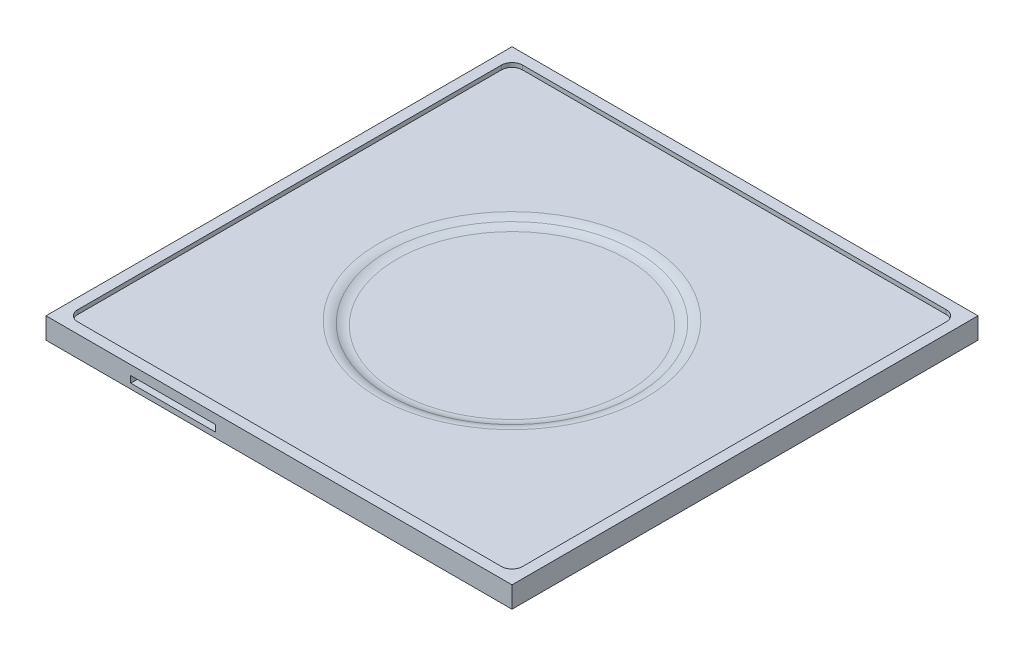
ISO-10303-21;
HEADER;
FILE_DESCRIPTION(('STEP AP214'),'2;1');
FILE_NAME('part.step','',(''),(''),'','','');
FILE_SCHEMA(('AUTOMOTIVE_DESIGN { 1 0 10303 214 1 1 1 1 }'));
ENDSEC;
DATA;
#1=APPLICATION_CONTEXT('core data for automotive mechanical design processes');
#2=APPLICATION_PROTOCOL_DEFINITION('international standard','automotive_design',2000,#1);
#3=PRODUCT_CONTEXT('',#1,'mechanical');
#4=PRODUCT('Part','Part','',(#3));
#5=PRODUCT_RELATED_PRODUCT_CATEGORY('part','',(#4));
#6=PRODUCT_DEFINITION_FORMATION('','',#4);
#7=PRODUCT_DEFINITION_CONTEXT('part definition',#1,'design');
#8=PRODUCT_DEFINITION('design','',#6,#7);
#9=PRODUCT_DEFINITION_SHAPE('','',#8);
#10=(LENGTH_UNIT() NAMED_UNIT(*) SI_UNIT(.MILLI.,.METRE.));
#11=(NAMED_UNIT(*) PLANE_ANGLE_UNIT() SI_UNIT($,.RADIAN.));
#12=(NAMED_UNIT(*) SI_UNIT($,.STERADIAN.) SOLID_ANGLE_UNIT());
#13=UNCERTAINTY_MEASURE_WITH_UNIT(LENGTH_MEASURE(1.E-05),#10,'distance_accuracy_value','');
#14=(GEOMETRIC_REPRESENTATION_CONTEXT(3) GLOBAL_UNCERTAINTY_ASSIGNED_CONTEXT((#13)) GLOBAL_UNIT_ASSIGNED_CONTEXT((#10,
#11,#12)) REPRESENTATION_CONTEXT('',''));
#15=CARTESIAN_POINT('',(0.,0.,0.));
#16=DIRECTION('',(0.,0.,1.));
#17=DIRECTION('',(1.,0.,0.));
#18=AXIS2_PLACEMENT_3D('',#15,#16,#17);
#19=CARTESIAN_POINT('',(-110.,10.,-110.));
#20=DIRECTION('',(1.,0.,0.));
#21=DIRECTION('',(0.,0.,-1.));
#22=AXIS2_PLACEMENT_3D('',#19,#20,#21);
#23=PLANE('',#22);
#24=DIRECTION('',(0.,0.,1.));
#25=VECTOR('',#24,1.);
#26=CARTESIAN_POINT('',(-110.,0.,-110.));
#27=LINE('',#26,#25);
#28=CARTESIAN_POINT('',(-110.,0.,-110.));
#29=VERTEX_POINT('',#28);
#30=CARTESIAN_POINT('',(-110.,0.,110.));
#31=VERTEX_POINT('',#30);
#32=EDGE_CURVE('E223',#29,#31,#27,.T.);
#33=ORIENTED_EDGE('',*,*,#32,.T.);
#34=DIRECTION('',(0.,-1.,0.));
#35=VECTOR('',#34,1.);
#36=CARTESIAN_POINT('',(-110.,10.,110.));
#37=LINE('',#36,#35);
#38=CARTESIAN_POINT('',(-110.,10.,110.));
#39=VERTEX_POINT('',#38);
#40=EDGE_CURVE('E272',#39,#31,#37,.T.);
#41=ORIENTED_EDGE('',*,*,#40,.F.);
#42=DIRECTION('',(0.,0.,1.));
#43=VECTOR('',#42,1.);
#44=CARTESIAN_POINT('',(-110.,10.,-110.));
#45=LINE('',#44,#43);
#46=CARTESIAN_POINT('',(-110.,10.,-110.));
#47=VERTEX_POINT('',#46);
#48=EDGE_CURVE('E235',#47,#39,#45,.T.);
#49=ORIENTED_EDGE('',*,*,#48,.F.);
#50=DIRECTION('',(0.,-1.,0.));
#51=VECTOR('',#50,1.);
#52=CARTESIAN_POINT('',(-110.,10.,-110.));
#53=LINE('',#52,#51);
#54=EDGE_CURVE('E249',#47,#29,#53,.T.);
#55=ORIENTED_EDGE('',*,*,#54,.T.);
#56=EDGE_LOOP('',(#33,#41,#49,#55));
#57=FACE_BOUND('',#56,.T.);
#58=ADVANCED_FACE('F44',(#57),#23,.F.);
#59=CARTESIAN_POINT('',(110.,10.,110.));
#60=DIRECTION('',(0.,0.,-1.));
#61=DIRECTION('',(-1.,0.,0.));
#62=AXIS2_PLACEMENT_3D('',#59,#60,#61);
#63=PLANE('',#62);
#64=DIRECTION('',(1.,0.,0.));
#65=VECTOR('',#64,1.);
#66=CARTESIAN_POINT('',(-70.,2.45,110.));
#67=LINE('',#66,#65);
#68=CARTESIAN_POINT('',(-70.,2.45,110.));
#69=VERTEX_POINT('',#68);
#70=CARTESIAN_POINT('',(-30.,2.45,110.));
#71=VERTEX_POINT('',#70);
#72=EDGE_CURVE('E193',#69,#71,#67,.T.);
#73=ORIENTED_EDGE('',*,*,#72,.F.);
#74=DIRECTION('',(0.,-1.,0.));
#75=VECTOR('',#74,1.);
#76=CARTESIAN_POINT('',(-70.,5.55,110.));
#77=LINE('',#76,#75);
#78=CARTESIAN_POINT('',(-70.,5.55,110.));
#79=VERTEX_POINT('',#78);
#80=EDGE_CURVE('E60',#79,#69,#77,.T.);
#81=ORIENTED_EDGE('',*,*,#80,.F.);
#82=DIRECTION('',(-1.,0.,0.));
#83=VECTOR('',#82,1.);
#84=CARTESIAN_POINT('',(-70.,5.55,110.));
#85=LINE('',#84,#83);
#86=CARTESIAN_POINT('',(-30.,5.55,110.));
#87=VERTEX_POINT('',#86);
#88=EDGE_CURVE('E180',#87,#79,#85,.T.);
#89=ORIENTED_EDGE('',*,*,#88,.F.);
#90=DIRECTION('',(0.,1.,0.));
#91=VECTOR('',#90,1.);
#92=CARTESIAN_POINT('',(-30.,5.55,110.));
#93=LINE('',#92,#91);
#94=EDGE_CURVE('E184',#71,#87,#93,.T.);
#95=ORIENTED_EDGE('',*,*,#94,.F.);
#96=EDGE_LOOP('',(#73,#81,#89,#95));
#97=FACE_BOUND('',#96,.T.);
#98=DIRECTION('',(1.,0.,0.));
#99=VECTOR('',#98,1.);
#100=CARTESIAN_POINT('',(110.,0.,110.));
#101=LINE('',#100,#99);
#102=CARTESIAN_POINT('',(110.,0.,110.));
#103=VERTEX_POINT('',#102);
#104=EDGE_CURVE('E253',#31,#103,#101,.T.);
#105=ORIENTED_EDGE('',*,*,#104,.T.);
#106=DIRECTION('',(0.,-1.,0.));
#107=VECTOR('',#106,1.);
#108=CARTESIAN_POINT('',(110.,10.,110.));
#109=LINE('',#108,#107);
#110=CARTESIAN_POINT('',(110.,10.,110.));
#111=VERTEX_POINT('',#110);
#112=EDGE_CURVE('E268',#111,#103,#109,.T.);
#113=ORIENTED_EDGE('',*,*,#112,.F.);
#114=DIRECTION('',(1.,0.,0.));
#115=VECTOR('',#114,1.);
#116=CARTESIAN_POINT('',(110.,10.,110.));
#117=LINE('',#116,#115);
#118=EDGE_CURVE('E239',#39,#111,#117,.T.);
#119=ORIENTED_EDGE('',*,*,#118,.F.);
#120=ORIENTED_EDGE('',*,*,#40,.T.);
#121=EDGE_LOOP('',(#105,#113,#119,#120));
#122=FACE_BOUND('',#121,.T.);
#123=ADVANCED_FACE('F384',(#97,#122),#63,.F.);
#124=CARTESIAN_POINT('',(110.,10.,-110.));
#125=DIRECTION('',(-1.,0.,0.));
#126=DIRECTION('',(0.,0.,1.));
#127=AXIS2_PLACEMENT_3D('',#124,#125,#126);
#128=PLANE('',#127);
#129=DIRECTION('',(0.,0.,-1.));
#130=VECTOR('',#129,1.);
#131=CARTESIAN_POINT('',(110.,0.,-110.));
#132=LINE('',#131,#130);
#133=CARTESIAN_POINT('',(110.,0.,-110.));
#134=VERTEX_POINT('',#133);
#135=EDGE_CURVE('E256',#103,#134,#132,.T.);
#136=ORIENTED_EDGE('',*,*,#135,.T.);
#137=DIRECTION('',(0.,-1.,0.));
#138=VECTOR('',#137,1.);
#139=CARTESIAN_POINT('',(110.,10.,-110.));
#140=LINE('',#139,#138);
#141=CARTESIAN_POINT('',(110.,10.,-110.));
#142=VERTEX_POINT('',#141);
#143=EDGE_CURVE('E264',#142,#134,#140,.T.);
#144=ORIENTED_EDGE('',*,*,#143,.F.);
#145=DIRECTION('',(0.,0.,-1.));
#146=VECTOR('',#145,1.);
#147=CARTESIAN_POINT('',(110.,10.,-110.));
#148=LINE('',#147,#146);
#149=EDGE_CURVE('E243',#111,#142,#148,.T.);
#150=ORIENTED_EDGE('',*,*,#149,.F.);
#151=ORIENTED_EDGE('',*,*,#112,.T.);
#152=EDGE_LOOP('',(#136,#144,#150,#151));
#153=FACE_BOUND('',#152,.T.);
#154=ADVANCED_FACE('F390',(#153),#128,.F.);
#155=CARTESIAN_POINT('',(110.,10.,-110.));
#156=DIRECTION('',(0.,0.,1.));
#157=DIRECTION('',(1.,0.,0.));
#158=AXIS2_PLACEMENT_3D('',#155,#156,#157);
#159=PLANE('',#158);
#160=DIRECTION('',(-1.,0.,0.));
#161=VECTOR('',#160,1.);
#162=CARTESIAN_POINT('',(110.,0.,-110.));
#163=LINE('',#162,#161);
#164=EDGE_CURVE('E240',#134,#29,#163,.T.);
#165=ORIENTED_EDGE('',*,*,#164,.T.);
#166=ORIENTED_EDGE('',*,*,#54,.F.);
#167=DIRECTION('',(-1.,0.,0.));
#168=VECTOR('',#167,1.);
#169=CARTESIAN_POINT('',(110.,10.,-110.));
#170=LINE('',#169,#168);
#171=EDGE_CURVE('E246',#142,#47,#170,.T.);
#172=ORIENTED_EDGE('',*,*,#171,.F.);
#173=ORIENTED_EDGE('',*,*,#143,.T.);
#174=EDGE_LOOP('',(#165,#166,#172,#173));
#175=FACE_BOUND('',#174,.T.);
#176=ADVANCED_FACE('F431',(#175),#159,.F.);
#177=CARTESIAN_POINT('',(0.,10.,0.));
#178=DIRECTION('',(0.,-1.,0.));
#179=DIRECTION('',(0.,0.,-1.));
#180=AXIS2_PLACEMENT_3D('',#177,#178,#179);
#181=PLANE('',#180);
#182=DIRECTION('',(1.,0.,0.));
#183=VECTOR('',#182,1.);
#184=CARTESIAN_POINT('',(105.,10.,105.));
#185=LINE('',#184,#183);
#186=CARTESIAN_POINT('',(-100.,10.,105.));
#187=VERTEX_POINT('',#186);
#188=CARTESIAN_POINT('',(100.,10.,105.));
#189=VERTEX_POINT('',#188);
#190=EDGE_CURVE('E227',#187,#189,#185,.T.);
#191=ORIENTED_EDGE('',*,*,#190,.F.);
#192=CARTESIAN_POINT('',(-100.,10.,100.));
#193=DIRECTION('',(0.,-1.,0.));
#194=DIRECTION('',(0.,0.,-1.));
#195=AXIS2_PLACEMENT_3D('',#192,#193,#194);
#196=CIRCLE('',#195,5.);
#197=CARTESIAN_POINT('',(-105.,10.,100.));
#198=VERTEX_POINT('',#197);
#199=EDGE_CURVE('E328',#187,#198,#196,.T.);
#200=ORIENTED_EDGE('',*,*,#199,.T.);
#201=DIRECTION('',(0.,0.,1.));
#202=VECTOR('',#201,1.);
#203=CARTESIAN_POINT('',(-105.,10.,-105.));
#204=LINE('',#203,#202);
#205=CARTESIAN_POINT('',(-105.,10.,-100.));
#206=VERTEX_POINT('',#205);
#207=EDGE_CURVE('E202',#206,#198,#204,.T.);
#208=ORIENTED_EDGE('',*,*,#207,.F.);
#209=CARTESIAN_POINT('',(-100.,10.,-100.));
#210=DIRECTION('',(0.,-1.,0.));
#211=DIRECTION('',(0.,0.,-1.));
#212=AXIS2_PLACEMENT_3D('',#209,#210,#211);
#213=CIRCLE('',#212,5.);
#214=CARTESIAN_POINT('',(-100.,10.,-105.));
#215=VERTEX_POINT('',#214);
#216=EDGE_CURVE('E299',#206,#215,#213,.T.);
#217=ORIENTED_EDGE('',*,*,#216,.T.);
#218=DIRECTION('',(-1.,0.,0.));
#219=VECTOR('',#218,1.);
#220=CARTESIAN_POINT('',(105.,10.,-105.));
#221=LINE('',#220,#219);
#222=CARTESIAN_POINT('',(100.,10.,-105.));
#223=VERTEX_POINT('',#222);
#224=EDGE_CURVE('E213',#223,#215,#221,.T.);
#225=ORIENTED_EDGE('',*,*,#224,.F.);
#226=CARTESIAN_POINT('',(100.,10.,-100.));
#227=DIRECTION('',(0.,-1.,0.));
#228=DIRECTION('',(0.,0.,-1.));
#229=AXIS2_PLACEMENT_3D('',#226,#227,#228);
#230=CIRCLE('',#229,5.);
#231=CARTESIAN_POINT('',(105.,10.,-100.));
#232=VERTEX_POINT('',#231);
#233=EDGE_CURVE('E314',#223,#232,#230,.T.);
#234=ORIENTED_EDGE('',*,*,#233,.T.);
#235=DIRECTION('',(0.,0.,-1.));
#236=VECTOR('',#235,1.);
#237=CARTESIAN_POINT('',(105.,10.,-105.));
#238=LINE('',#237,#236);
#239=CARTESIAN_POINT('',(105.,10.,100.));
#240=VERTEX_POINT('',#239);
#241=EDGE_CURVE('E230',#240,#232,#238,.T.);
#242=ORIENTED_EDGE('',*,*,#241,.F.);
#243=CARTESIAN_POINT('',(100.,10.,100.));
#244=DIRECTION('',(0.,-1.,0.));
#245=DIRECTION('',(0.,0.,-1.));
#246=AXIS2_PLACEMENT_3D('',#243,#244,#245);
#247=CIRCLE('',#246,5.);
#248=EDGE_CURVE('E11',#240,#189,#247,.T.);
#249=ORIENTED_EDGE('',*,*,#248,.T.);
#250=EDGE_LOOP('',(#191,#200,#208,#217,#225,#234,#242,#249));
#251=FACE_BOUND('',#250,.T.);
#252=ORIENTED_EDGE('',*,*,#48,.T.);
#253=ORIENTED_EDGE('',*,*,#118,.T.);
#254=ORIENTED_EDGE('',*,*,#149,.T.);
#255=ORIENTED_EDGE('',*,*,#171,.T.);
#256=EDGE_LOOP('',(#252,#253,#254,#255));
#257=FACE_BOUND('',#256,.T.);
#258=ADVANCED_FACE('F353',(#251,#257),#181,.F.);
#259=CARTESIAN_POINT('',(0.,0.,0.));
#260=DIRECTION('',(0.,-1.,0.));
#261=DIRECTION('',(0.,0.,-1.));
#262=AXIS2_PLACEMENT_3D('',#259,#260,#261);
#263=PLANE('',#262);
#264=ORIENTED_EDGE('',*,*,#32,.F.);
#265=ORIENTED_EDGE('',*,*,#164,.F.);
#266=ORIENTED_EDGE('',*,*,#135,.F.);
#267=ORIENTED_EDGE('',*,*,#104,.F.);
#268=EDGE_LOOP('',(#264,#265,#266,#267));
#269=FACE_BOUND('',#268,.T.);
#270=ADVANCED_FACE('F428',(#269),#263,.T.);
#271=CARTESIAN_POINT('',(-105.,8.,-105.));
#272=DIRECTION('',(-1.,0.,0.));
#273=DIRECTION('',(0.,0.,1.));
#274=AXIS2_PLACEMENT_3D('',#271,#272,#273);
#275=PLANE('',#274);
#276=ORIENTED_EDGE('',*,*,#207,.T.);
#277=DIRECTION('',(0.,1.,0.));
#278=VECTOR('',#277,1.);
#279=CARTESIAN_POINT('',(-105.,8.,100.));
#280=LINE('',#279,#278);
#281=CARTESIAN_POINT('',(-105.,8.,100.));
#282=VERTEX_POINT('',#281);
#283=EDGE_CURVE('E322',#198,#282,#280,.F.);
#284=ORIENTED_EDGE('',*,*,#283,.T.);
#285=DIRECTION('',(0.,0.,1.));
#286=VECTOR('',#285,1.);
#287=CARTESIAN_POINT('',(-105.,8.,-105.));
#288=LINE('',#287,#286);
#289=CARTESIAN_POINT('',(-105.,8.,-100.));
#290=VERTEX_POINT('',#289);
#291=EDGE_CURVE('E208',#290,#282,#288,.T.);
#292=ORIENTED_EDGE('',*,*,#291,.F.);
#293=DIRECTION('',(0.,1.,0.));
#294=VECTOR('',#293,1.);
#295=CARTESIAN_POINT('',(-105.,10.,-100.));
#296=LINE('',#295,#294);
#297=EDGE_CURVE('E288',#290,#206,#296,.T.);
#298=ORIENTED_EDGE('',*,*,#297,.T.);
#299=EDGE_LOOP('',(#276,#284,#292,#298));
#300=FACE_BOUND('',#299,.T.);
#301=ADVANCED_FACE('F359',(#300),#275,.F.);
#302=CARTESIAN_POINT('',(105.,8.,-105.));
#303=DIRECTION('',(0.,0.,-1.));
#304=DIRECTION('',(-1.,0.,0.));
#305=AXIS2_PLACEMENT_3D('',#302,#303,#304);
#306=PLANE('',#305);
#307=DIRECTION('',(-1.,0.,0.));
#308=VECTOR('',#307,1.);
#309=CARTESIAN_POINT('',(105.,8.,-105.));
#310=LINE('',#309,#308);
#311=CARTESIAN_POINT('',(100.,8.,-105.));
#312=VERTEX_POINT('',#311);
#313=CARTESIAN_POINT('',(-100.,8.,-105.));
#314=VERTEX_POINT('',#313);
#315=EDGE_CURVE('E220',#312,#314,#310,.T.);
#316=ORIENTED_EDGE('',*,*,#315,.F.);
#317=DIRECTION('',(0.,1.,0.));
#318=VECTOR('',#317,1.);
#319=CARTESIAN_POINT('',(100.,10.,-105.));
#320=LINE('',#319,#318);
#321=EDGE_CURVE('E303',#312,#223,#320,.T.);
#322=ORIENTED_EDGE('',*,*,#321,.T.);
#323=ORIENTED_EDGE('',*,*,#224,.T.);
#324=DIRECTION('',(0.,1.,0.));
#325=VECTOR('',#324,1.);
#326=CARTESIAN_POINT('',(-100.,8.,-105.));
#327=LINE('',#326,#325);
#328=EDGE_CURVE('E292',#215,#314,#327,.F.);
#329=ORIENTED_EDGE('',*,*,#328,.T.);
#330=EDGE_LOOP('',(#316,#322,#323,#329));
#331=FACE_BOUND('',#330,.T.);
#332=ADVANCED_FACE('F371',(#331),#306,.F.);
#333=CARTESIAN_POINT('',(105.,8.,-105.));
#334=DIRECTION('',(1.,0.,0.));
#335=DIRECTION('',(0.,0.,-1.));
#336=AXIS2_PLACEMENT_3D('',#333,#334,#335);
#337=PLANE('',#336);
#338=DIRECTION('',(0.,0.,-1.));
#339=VECTOR('',#338,1.);
#340=CARTESIAN_POINT('',(105.,8.,-105.));
#341=LINE('',#340,#339);
#342=CARTESIAN_POINT('',(105.,8.,100.));
#343=VERTEX_POINT('',#342);
#344=CARTESIAN_POINT('',(105.,8.,-100.));
#345=VERTEX_POINT('',#344);
#346=EDGE_CURVE('E217',#343,#345,#341,.T.);
#347=ORIENTED_EDGE('',*,*,#346,.F.);
#348=DIRECTION('',(0.,1.,0.));
#349=VECTOR('',#348,1.);
#350=CARTESIAN_POINT('',(105.,10.,100.));
#351=LINE('',#350,#349);
#352=EDGE_CURVE('E331',#343,#240,#351,.T.);
#353=ORIENTED_EDGE('',*,*,#352,.T.);
#354=ORIENTED_EDGE('',*,*,#241,.T.);
#355=DIRECTION('',(0.,1.,0.));
#356=VECTOR('',#355,1.);
#357=CARTESIAN_POINT('',(105.,8.,-100.));
#358=LINE('',#357,#356);
#359=EDGE_CURVE('E307',#232,#345,#358,.F.);
#360=ORIENTED_EDGE('',*,*,#359,.T.);
#361=EDGE_LOOP('',(#347,#353,#354,#360));
#362=FACE_BOUND('',#361,.T.);
#363=ADVANCED_FACE('F347',(#362),#337,.F.);
#364=CARTESIAN_POINT('',(105.,8.,105.));
#365=DIRECTION('',(0.,0.,1.));
#366=DIRECTION('',(1.,0.,0.));
#367=AXIS2_PLACEMENT_3D('',#364,#365,#366);
#368=PLANE('',#367);
#369=ORIENTED_EDGE('',*,*,#190,.T.);
#370=DIRECTION('',(0.,1.,0.));
#371=VECTOR('',#370,1.);
#372=CARTESIAN_POINT('',(100.,8.,105.));
#373=LINE('',#372,#371);
#374=CARTESIAN_POINT('',(100.,8.,105.));
#375=VERTEX_POINT('',#374);
#376=EDGE_CURVE('E335',#189,#375,#373,.F.);
#377=ORIENTED_EDGE('',*,*,#376,.T.);
#378=DIRECTION('',(1.,0.,0.));
#379=VECTOR('',#378,1.);
#380=CARTESIAN_POINT('',(105.,8.,105.));
#381=LINE('',#380,#379);
#382=CARTESIAN_POINT('',(-100.,8.,105.));
#383=VERTEX_POINT('',#382);
#384=EDGE_CURVE('E212',#383,#375,#381,.T.);
#385=ORIENTED_EDGE('',*,*,#384,.F.);
#386=DIRECTION('',(0.,1.,0.));
#387=VECTOR('',#386,1.);
#388=CARTESIAN_POINT('',(-100.,10.,105.));
#389=LINE('',#388,#387);
#390=EDGE_CURVE('E318',#383,#187,#389,.T.);
#391=ORIENTED_EDGE('',*,*,#390,.T.);
#392=EDGE_LOOP('',(#369,#377,#385,#391));
#393=FACE_BOUND('',#392,.T.);
#394=ADVANCED_FACE('F351',(#393),#368,.F.);
#395=CARTESIAN_POINT('',(0.,8.,0.));
#396=DIRECTION('',(0.,-1.,0.));
#397=DIRECTION('',(0.,0.,-1.));
#398=AXIS2_PLACEMENT_3D('',#395,#396,#397);
#399=PLANE('',#398);
#400=CARTESIAN_POINT('',(0.,8.,0.));
#401=DIRECTION('',(0.,-1.,0.));
#402=DIRECTION('',(0.,0.,-1.));
#403=AXIS2_PLACEMENT_3D('',#400,#401,#402);
#404=CIRCLE('',#403,63.0427978870813);
#405=CARTESIAN_POINT('',(0.,8.,-63.0427978870813));
#406=VERTEX_POINT('',#405);
#407=EDGE_CURVE('E284',#406,#406,#404,.T.);
#408=ORIENTED_EDGE('',*,*,#407,.T.);
#409=EDGE_LOOP('',(#408));
#410=FACE_BOUND('',#409,.T.);
#411=ORIENTED_EDGE('',*,*,#384,.T.);
#412=CARTESIAN_POINT('',(100.,8.,100.));
#413=DIRECTION('',(0.,-1.,0.));
#414=DIRECTION('',(0.,0.,-1.));
#415=AXIS2_PLACEMENT_3D('',#412,#413,#414);
#416=CIRCLE('',#415,5.);
#417=EDGE_CURVE('E53',#375,#343,#416,.F.);
#418=ORIENTED_EDGE('',*,*,#417,.T.);
#419=ORIENTED_EDGE('',*,*,#346,.T.);
#420=CARTESIAN_POINT('',(100.,8.,-100.));
#421=DIRECTION('',(0.,-1.,0.));
#422=DIRECTION('',(0.,0.,-1.));
#423=AXIS2_PLACEMENT_3D('',#420,#421,#422);
#424=CIRCLE('',#423,5.);
#425=EDGE_CURVE('E311',#345,#312,#424,.F.);
#426=ORIENTED_EDGE('',*,*,#425,.T.);
#427=ORIENTED_EDGE('',*,*,#315,.T.);
#428=CARTESIAN_POINT('',(-100.,8.,-100.));
#429=DIRECTION('',(0.,-1.,0.));
#430=DIRECTION('',(0.,0.,-1.));
#431=AXIS2_PLACEMENT_3D('',#428,#429,#430);
#432=CIRCLE('',#431,5.);
#433=EDGE_CURVE('E296',#314,#290,#432,.F.);
#434=ORIENTED_EDGE('',*,*,#433,.T.);
#435=ORIENTED_EDGE('',*,*,#291,.T.);
#436=CARTESIAN_POINT('',(-100.,8.,100.));
#437=DIRECTION('',(0.,-1.,0.));
#438=DIRECTION('',(0.,0.,-1.));
#439=AXIS2_PLACEMENT_3D('',#436,#437,#438);
#440=CIRCLE('',#439,5.);
#441=EDGE_CURVE('E325',#282,#383,#440,.F.);
#442=ORIENTED_EDGE('',*,*,#441,.T.);
#443=EDGE_LOOP('',(#411,#418,#419,#426,#427,#434,#435,#442));
#444=FACE_BOUND('',#443,.T.);
#445=ADVANCED_FACE('F341',(#410,#444),#399,.F.);
#446=CARTESIAN_POINT('',(0.,6.,0.));
#447=DIRECTION('',(0.,1.,0.));
#448=DIRECTION('',(0.,0.,1.));
#449=AXIS2_PLACEMENT_3D('',#446,#447,#448);
#450=PLANE('',#449);
#451=CARTESIAN_POINT('',(0.,6.,0.));
#452=DIRECTION('',(0.,1.,0.));
#453=DIRECTION('',(0.,0.,1.));
#454=AXIS2_PLACEMENT_3D('',#451,#452,#453);
#455=CIRCLE('',#454,54.325);
#456=CARTESIAN_POINT('',(0.,6.,54.325));
#457=VERTEX_POINT('',#456);
#458=EDGE_CURVE('E276',#457,#457,#455,.T.);
#459=ORIENTED_EDGE('',*,*,#458,.T.);
#460=EDGE_LOOP('',(#459));
#461=FACE_BOUND('',#460,.T.);
#462=ADVANCED_FACE('F398',(#461),#450,.T.);
#463=CARTESIAN_POINT('',(0.,16.,0.));
#464=DIRECTION('',(0.,-1.,0.));
#465=DIRECTION('',(0.,0.,-1.));
#466=AXIS2_PLACEMENT_3D('',#463,#464,#465);
#467=TOROIDAL_SURFACE('',#466,54.325,10.);
#468=CARTESIAN_POINT('',(0.,6.9999999999999,0.));
#469=DIRECTION('',(0.,1.,0.));
#470=DIRECTION('',(0.,0.,1.));
#471=AXIS2_PLACEMENT_3D('',#468,#469,#470);
#472=CIRCLE('',#471,58.6838989435407);
#473=CARTESIAN_POINT('',(0.,6.9999999999999,58.6838989435407));
#474=VERTEX_POINT('',#473);
#475=EDGE_CURVE('E280',#474,#474,#472,.T.);
#476=ORIENTED_EDGE('',*,*,#475,.T.);
#477=EDGE_LOOP('',(#476));
#478=FACE_BOUND('',#477,.T.);
#479=ORIENTED_EDGE('',*,*,#458,.F.);
#480=EDGE_LOOP('',(#479));
#481=FACE_BOUND('',#480,.T.);
#482=ADVANCED_FACE('F395',(#478,#481),#467,.F.);
#483=CARTESIAN_POINT('',(0.,-2.,0.));
#484=DIRECTION('',(0.,-1.,0.));
#485=DIRECTION('',(0.,0.,-1.));
#486=AXIS2_PLACEMENT_3D('',#483,#484,#485);
#487=TOROIDAL_SURFACE('',#486,63.0427978870813,10.);
#488=ORIENTED_EDGE('',*,*,#407,.F.);
#489=EDGE_LOOP('',(#488));
#490=FACE_BOUND('',#489,.T.);
#491=ORIENTED_EDGE('',*,*,#475,.F.);
#492=EDGE_LOOP('',(#491));
#493=FACE_BOUND('',#492,.T.);
#494=ADVANCED_FACE('F381',(#490,#493),#487,.T.);
#495=CARTESIAN_POINT('',(-100.,8.,-100.));
#496=DIRECTION('',(0.,-1.,0.));
#497=DIRECTION('',(0.,0.,-1.));
#498=AXIS2_PLACEMENT_3D('',#495,#496,#497);
#499=CYLINDRICAL_SURFACE('',#498,5.);
#500=ORIENTED_EDGE('',*,*,#433,.F.);
#501=ORIENTED_EDGE('',*,*,#328,.F.);
#502=ORIENTED_EDGE('',*,*,#216,.F.);
#503=ORIENTED_EDGE('',*,*,#297,.F.);
#504=EDGE_LOOP('',(#500,#501,#502,#503));
#505=FACE_BOUND('',#504,.T.);
#506=ADVANCED_FACE('F366',(#505),#499,.F.);
#507=CARTESIAN_POINT('',(100.,8.,-100.));
#508=DIRECTION('',(0.,-1.,0.));
#509=DIRECTION('',(0.,0.,-1.));
#510=AXIS2_PLACEMENT_3D('',#507,#508,#509);
#511=CYLINDRICAL_SURFACE('',#510,5.);
#512=ORIENTED_EDGE('',*,*,#425,.F.);
#513=ORIENTED_EDGE('',*,*,#359,.F.);
#514=ORIENTED_EDGE('',*,*,#233,.F.);
#515=ORIENTED_EDGE('',*,*,#321,.F.);
#516=EDGE_LOOP('',(#512,#513,#514,#515));
#517=FACE_BOUND('',#516,.T.);
#518=ADVANCED_FACE('F374',(#517),#511,.F.);
#519=CARTESIAN_POINT('',(-100.,8.,100.));
#520=DIRECTION('',(0.,-1.,0.));
#521=DIRECTION('',(0.,0.,-1.));
#522=AXIS2_PLACEMENT_3D('',#519,#520,#521);
#523=CYLINDRICAL_SURFACE('',#522,5.);
#524=ORIENTED_EDGE('',*,*,#441,.F.);
#525=ORIENTED_EDGE('',*,*,#283,.F.);
#526=ORIENTED_EDGE('',*,*,#199,.F.);
#527=ORIENTED_EDGE('',*,*,#390,.F.);
#528=EDGE_LOOP('',(#524,#525,#526,#527));
#529=FACE_BOUND('',#528,.T.);
#530=ADVANCED_FACE('F363',(#529),#523,.F.);
#531=CARTESIAN_POINT('',(100.,8.,100.));
#532=DIRECTION('',(0.,-1.,0.));
#533=DIRECTION('',(0.,0.,-1.));
#534=AXIS2_PLACEMENT_3D('',#531,#532,#533);
#535=CYLINDRICAL_SURFACE('',#534,5.);
#536=ORIENTED_EDGE('',*,*,#417,.F.);
#537=ORIENTED_EDGE('',*,*,#376,.F.);
#538=ORIENTED_EDGE('',*,*,#248,.F.);
#539=ORIENTED_EDGE('',*,*,#352,.F.);
#540=EDGE_LOOP('',(#536,#537,#538,#539));
#541=FACE_BOUND('',#540,.T.);
#542=ADVANCED_FACE('F46',(#541),#535,.F.);
#543=CARTESIAN_POINT('',(-70.,5.55,90.));
#544=DIRECTION('',(-1.,0.,0.));
#545=DIRECTION('',(0.,0.,1.));
#546=AXIS2_PLACEMENT_3D('',#543,#544,#545);
#547=PLANE('',#546);
#548=ORIENTED_EDGE('',*,*,#80,.T.);
#549=DIRECTION('',(0.,0.,1.));
#550=VECTOR('',#549,1.);
#551=CARTESIAN_POINT('',(-70.,2.45,90.));
#552=LINE('',#551,#550);
#553=CARTESIAN_POINT('',(-70.,2.45,90.));
#554=VERTEX_POINT('',#553);
#555=EDGE_CURVE('E155',#554,#69,#552,.T.);
#556=ORIENTED_EDGE('',*,*,#555,.F.);
#557=DIRECTION('',(0.,-1.,0.));
#558=VECTOR('',#557,1.);
#559=CARTESIAN_POINT('',(-70.,5.55,90.));
#560=LINE('',#559,#558);
#561=CARTESIAN_POINT('',(-70.,5.55,90.));
#562=VERTEX_POINT('',#561);
#563=EDGE_CURVE('E159',#562,#554,#560,.T.);
#564=ORIENTED_EDGE('',*,*,#563,.F.);
#565=DIRECTION('',(0.,0.,1.));
#566=VECTOR('',#565,1.);
#567=CARTESIAN_POINT('',(-70.,5.55,90.));
#568=LINE('',#567,#566);
#569=EDGE_CURVE('E199',#562,#79,#568,.T.);
#570=ORIENTED_EDGE('',*,*,#569,.T.);
#571=EDGE_LOOP('',(#548,#556,#564,#570));
#572=FACE_BOUND('',#571,.T.);
#573=ADVANCED_FACE('F157',(#572),#547,.F.);
#574=CARTESIAN_POINT('',(-70.,5.55,90.));
#575=DIRECTION('',(0.,1.,0.));
#576=DIRECTION('',(0.,0.,1.));
#577=AXIS2_PLACEMENT_3D('',#574,#575,#576);
#578=PLANE('',#577);
#579=ORIENTED_EDGE('',*,*,#88,.T.);
#580=ORIENTED_EDGE('',*,*,#569,.F.);
#581=DIRECTION('',(-1.,0.,0.));
#582=VECTOR('',#581,1.);
#583=CARTESIAN_POINT('',(-70.,5.55,90.));
#584=LINE('',#583,#582);
#585=CARTESIAN_POINT('',(-30.,5.55,90.));
#586=VERTEX_POINT('',#585);
#587=EDGE_CURVE('E166',#586,#562,#584,.T.);
#588=ORIENTED_EDGE('',*,*,#587,.F.);
#589=DIRECTION('',(0.,0.,1.));
#590=VECTOR('',#589,1.);
#591=CARTESIAN_POINT('',(-30.,5.55,90.));
#592=LINE('',#591,#590);
#593=EDGE_CURVE('E203',#586,#87,#592,.T.);
#594=ORIENTED_EDGE('',*,*,#593,.T.);
#595=EDGE_LOOP('',(#579,#580,#588,#594));
#596=FACE_BOUND('',#595,.T.);
#597=ADVANCED_FACE('F533',(#596),#578,.F.);
#598=CARTESIAN_POINT('',(-30.,5.55,90.));
#599=DIRECTION('',(1.,0.,0.));
#600=DIRECTION('',(0.,0.,-1.));
#601=AXIS2_PLACEMENT_3D('',#598,#599,#600);
#602=PLANE('',#601);
#603=ORIENTED_EDGE('',*,*,#94,.T.);
#604=ORIENTED_EDGE('',*,*,#593,.F.);
#605=DIRECTION('',(0.,1.,0.));
#606=VECTOR('',#605,1.);
#607=CARTESIAN_POINT('',(-30.,5.55,90.));
#608=LINE('',#607,#606);
#609=CARTESIAN_POINT('',(-30.,2.45,90.));
#610=VERTEX_POINT('',#609);
#611=EDGE_CURVE('E175',#610,#586,#608,.T.);
#612=ORIENTED_EDGE('',*,*,#611,.F.);
#613=DIRECTION('',(0.,0.,1.));
#614=VECTOR('',#613,1.);
#615=CARTESIAN_POINT('',(-30.,2.45,90.));
#616=LINE('',#615,#614);
#617=EDGE_CURVE('E165',#610,#71,#616,.T.);
#618=ORIENTED_EDGE('',*,*,#617,.T.);
#619=EDGE_LOOP('',(#603,#604,#612,#618));
#620=FACE_BOUND('',#619,.T.);
#621=ADVANCED_FACE('F541',(#620),#602,.F.);
#622=CARTESIAN_POINT('',(-70.,2.45,90.));
#623=DIRECTION('',(0.,-1.,0.));
#624=DIRECTION('',(0.,0.,-1.));
#625=AXIS2_PLACEMENT_3D('',#622,#623,#624);
#626=PLANE('',#625);
#627=ORIENTED_EDGE('',*,*,#72,.T.);
#628=ORIENTED_EDGE('',*,*,#617,.F.);
#629=DIRECTION('',(1.,0.,0.));
#630=VECTOR('',#629,1.);
#631=CARTESIAN_POINT('',(-70.,2.45,90.));
#632=LINE('',#631,#630);
#633=EDGE_CURVE('E169',#554,#610,#632,.T.);
#634=ORIENTED_EDGE('',*,*,#633,.F.);
#635=ORIENTED_EDGE('',*,*,#555,.T.);
#636=EDGE_LOOP('',(#627,#628,#634,#635));
#637=FACE_BOUND('',#636,.T.);
#638=ADVANCED_FACE('F170',(#637),#626,.F.);
#639=CARTESIAN_POINT('',(0.,0.,90.));
#640=DIRECTION('',(0.,0.,1.));
#641=DIRECTION('',(1.,0.,0.));
#642=AXIS2_PLACEMENT_3D('',#639,#640,#641);
#643=PLANE('',#642);
#644=ORIENTED_EDGE('',*,*,#563,.T.);
#645=ORIENTED_EDGE('',*,*,#633,.T.);
#646=ORIENTED_EDGE('',*,*,#611,.T.);
#647=ORIENTED_EDGE('',*,*,#587,.T.);
#648=EDGE_LOOP('',(#644,#645,#646,#647));
#649=FACE_BOUND('',#648,.T.);
#650=ADVANCED_FACE('F177',(#649),#643,.T.);
#651=CLOSED_SHELL('',(#58,#123,#154,#176,#258,#270,#301,#332,#363,#394,#445,#462,#482,#494,#506,
#518,#530,#542,#573,#597,#621,#638,#650));
#652=MANIFOLD_SOLID_BREP('B2',#651);
#653=ADVANCED_BREP_SHAPE_REPRESENTATION('',(#18,#652),#14);
#654=SHAPE_DEFINITION_REPRESENTATION(#9,#653);
ENDSEC;
END-ISO-10303-21;
